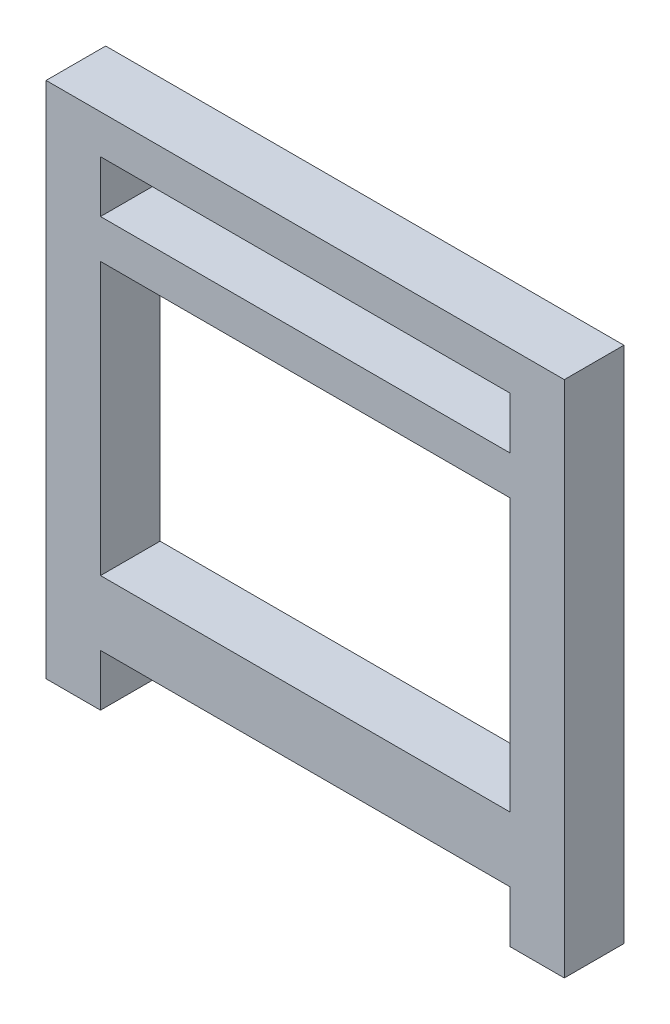
ISO-10303-21;
HEADER;
FILE_DESCRIPTION(('STEP AP214'),'2;1');
FILE_NAME('part.step','',(''),(''),'','','');
FILE_SCHEMA(('AUTOMOTIVE_DESIGN { 1 0 10303 214 1 1 1 1 }'));
ENDSEC;
DATA;
#1=APPLICATION_CONTEXT('core data for automotive mechanical design processes');
#2=APPLICATION_PROTOCOL_DEFINITION('international standard','automotive_design',2000,#1);
#3=PRODUCT_CONTEXT('',#1,'mechanical');
#4=PRODUCT('Part','Part','',(#3));
#5=PRODUCT_RELATED_PRODUCT_CATEGORY('part','',(#4));
#6=PRODUCT_DEFINITION_FORMATION('','',#4);
#7=PRODUCT_DEFINITION_CONTEXT('part definition',#1,'design');
#8=PRODUCT_DEFINITION('design','',#6,#7);
#9=PRODUCT_DEFINITION_SHAPE('','',#8);
#10=(LENGTH_UNIT() NAMED_UNIT(*) SI_UNIT(.MILLI.,.METRE.));
#11=(NAMED_UNIT(*) PLANE_ANGLE_UNIT() SI_UNIT($,.RADIAN.));
#12=(NAMED_UNIT(*) SI_UNIT($,.STERADIAN.) SOLID_ANGLE_UNIT());
#13=UNCERTAINTY_MEASURE_WITH_UNIT(LENGTH_MEASURE(1.E-05),#10,'distance_accuracy_value','');
#14=(GEOMETRIC_REPRESENTATION_CONTEXT(3) GLOBAL_UNCERTAINTY_ASSIGNED_CONTEXT((#13)) GLOBAL_UNIT_ASSIGNED_CONTEXT((#10,
#11,#12)) REPRESENTATION_CONTEXT('',''));
#15=CARTESIAN_POINT('',(0.,0.,0.));
#16=DIRECTION('',(0.,0.,1.));
#17=DIRECTION('',(1.,0.,0.));
#18=AXIS2_PLACEMENT_3D('',#15,#16,#17);
#19=CARTESIAN_POINT('',(0.,0.,2.3));
#20=DIRECTION('',(0.,0.,-1.));
#21=DIRECTION('',(-1.,0.,0.));
#22=AXIS2_PLACEMENT_3D('',#19,#20,#21);
#23=PLANE('',#22);
#24=DIRECTION('',(0.,1.,0.));
#25=VECTOR('',#24,1.);
#26=CARTESIAN_POINT('',(17.9,2.5,2.3));
#27=LINE('',#26,#25);
#28=CARTESIAN_POINT('',(17.9,2.5,2.3));
#29=VERTEX_POINT('',#28);
#30=CARTESIAN_POINT('',(17.9,13.,2.3));
#31=VERTEX_POINT('',#30);
#32=EDGE_CURVE('E207',#29,#31,#27,.T.);
#33=ORIENTED_EDGE('',*,*,#32,.F.);
#34=DIRECTION('',(1.,0.,0.));
#35=VECTOR('',#34,1.);
#36=CARTESIAN_POINT('',(2.1,2.5,2.3));
#37=LINE('',#36,#35);
#38=CARTESIAN_POINT('',(2.1,2.5,2.3));
#39=VERTEX_POINT('',#38);
#40=EDGE_CURVE('E218',#39,#29,#37,.T.);
#41=ORIENTED_EDGE('',*,*,#40,.F.);
#42=DIRECTION('',(0.,-1.,0.));
#43=VECTOR('',#42,1.);
#44=CARTESIAN_POINT('',(2.1,2.5,2.3));
#45=LINE('',#44,#43);
#46=CARTESIAN_POINT('',(2.1,13.,2.3));
#47=VERTEX_POINT('',#46);
#48=EDGE_CURVE('E214',#47,#39,#45,.T.);
#49=ORIENTED_EDGE('',*,*,#48,.F.);
#50=DIRECTION('',(-1.,0.,0.));
#51=VECTOR('',#50,1.);
#52=CARTESIAN_POINT('',(2.1,13.,2.3));
#53=LINE('',#52,#51);
#54=EDGE_CURVE('E210',#31,#47,#53,.T.);
#55=ORIENTED_EDGE('',*,*,#54,.F.);
#56=EDGE_LOOP('',(#33,#41,#49,#55));
#57=FACE_BOUND('',#56,.T.);
#58=DIRECTION('',(0.,-1.,0.));
#59=VECTOR('',#58,1.);
#60=CARTESIAN_POINT('',(0.,0.,2.3));
#61=LINE('',#60,#59);
#62=CARTESIAN_POINT('',(0.,18.,2.3));
#63=VERTEX_POINT('',#62);
#64=CARTESIAN_POINT('',(0.,-2.,2.3));
#65=VERTEX_POINT('',#64);
#66=EDGE_CURVE('E250',#63,#65,#61,.T.);
#67=ORIENTED_EDGE('',*,*,#66,.T.);
#68=DIRECTION('',(1.,0.,0.));
#69=VECTOR('',#68,1.);
#70=CARTESIAN_POINT('',(0.,-2.,2.3));
#71=LINE('',#70,#69);
#72=CARTESIAN_POINT('',(2.1,-2.,2.3));
#73=VERTEX_POINT('',#72);
#74=EDGE_CURVE('E253',#65,#73,#71,.T.);
#75=ORIENTED_EDGE('',*,*,#74,.T.);
#76=DIRECTION('',(0.,1.,0.));
#77=VECTOR('',#76,1.);
#78=CARTESIAN_POINT('',(2.1,-2.,2.3));
#79=LINE('',#78,#77);
#80=CARTESIAN_POINT('',(2.1,0.,2.3));
#81=VERTEX_POINT('',#80);
#82=EDGE_CURVE('E257',#73,#81,#79,.T.);
#83=ORIENTED_EDGE('',*,*,#82,.T.);
#84=DIRECTION('',(1.,0.,0.));
#85=VECTOR('',#84,1.);
#86=CARTESIAN_POINT('',(2.1,0.,2.3));
#87=LINE('',#86,#85);
#88=CARTESIAN_POINT('',(17.9,0.,2.3));
#89=VERTEX_POINT('',#88);
#90=EDGE_CURVE('E260',#81,#89,#87,.T.);
#91=ORIENTED_EDGE('',*,*,#90,.T.);
#92=DIRECTION('',(0.,-1.,0.));
#93=VECTOR('',#92,1.);
#94=CARTESIAN_POINT('',(17.9,-2.,2.3));
#95=LINE('',#94,#93);
#96=CARTESIAN_POINT('',(17.9,-2.,2.3));
#97=VERTEX_POINT('',#96);
#98=EDGE_CURVE('E263',#89,#97,#95,.T.);
#99=ORIENTED_EDGE('',*,*,#98,.T.);
#100=DIRECTION('',(1.,0.,0.));
#101=VECTOR('',#100,1.);
#102=CARTESIAN_POINT('',(20.,-2.,2.3));
#103=LINE('',#102,#101);
#104=CARTESIAN_POINT('',(20.,-2.,2.3));
#105=VERTEX_POINT('',#104);
#106=EDGE_CURVE('E266',#97,#105,#103,.T.);
#107=ORIENTED_EDGE('',*,*,#106,.T.);
#108=DIRECTION('',(0.,1.,0.));
#109=VECTOR('',#108,1.);
#110=CARTESIAN_POINT('',(20.,0.,2.3));
#111=LINE('',#110,#109);
#112=CARTESIAN_POINT('',(20.,18.,2.3));
#113=VERTEX_POINT('',#112);
#114=EDGE_CURVE('E269',#105,#113,#111,.T.);
#115=ORIENTED_EDGE('',*,*,#114,.T.);
#116=DIRECTION('',(-1.,0.,0.));
#117=VECTOR('',#116,1.);
#118=CARTESIAN_POINT('',(0.,18.,2.3));
#119=LINE('',#118,#117);
#120=EDGE_CURVE('E272',#113,#63,#119,.T.);
#121=ORIENTED_EDGE('',*,*,#120,.T.);
#122=EDGE_LOOP('',(#67,#75,#83,#91,#99,#107,#115,#121));
#123=FACE_BOUND('',#122,.T.);
#124=DIRECTION('',(0.,-1.,0.));
#125=VECTOR('',#124,1.);
#126=CARTESIAN_POINT('',(2.1,14.5,2.3));
#127=LINE('',#126,#125);
#128=CARTESIAN_POINT('',(2.1,16.5,2.3));
#129=VERTEX_POINT('',#128);
#130=CARTESIAN_POINT('',(2.1,14.5,2.3));
#131=VERTEX_POINT('',#130);
#132=EDGE_CURVE('E159',#129,#131,#127,.T.);
#133=ORIENTED_EDGE('',*,*,#132,.F.);
#134=DIRECTION('',(-1.,0.,0.));
#135=VECTOR('',#134,1.);
#136=CARTESIAN_POINT('',(2.1,16.5,2.3));
#137=LINE('',#136,#135);
#138=CARTESIAN_POINT('',(17.9,16.5,2.3));
#139=VERTEX_POINT('',#138);
#140=EDGE_CURVE('E185',#139,#129,#137,.T.);
#141=ORIENTED_EDGE('',*,*,#140,.F.);
#142=DIRECTION('',(0.,1.,0.));
#143=VECTOR('',#142,1.);
#144=CARTESIAN_POINT('',(17.9,14.5,2.3));
#145=LINE('',#144,#143);
#146=CARTESIAN_POINT('',(17.9,14.5,2.3));
#147=VERTEX_POINT('',#146);
#148=EDGE_CURVE('E181',#147,#139,#145,.T.);
#149=ORIENTED_EDGE('',*,*,#148,.F.);
#150=DIRECTION('',(1.,0.,0.));
#151=VECTOR('',#150,1.);
#152=CARTESIAN_POINT('',(2.1,14.5,2.3));
#153=LINE('',#152,#151);
#154=EDGE_CURVE('E168',#131,#147,#153,.T.);
#155=ORIENTED_EDGE('',*,*,#154,.F.);
#156=EDGE_LOOP('',(#133,#141,#149,#155));
#157=FACE_BOUND('',#156,.T.);
#158=ADVANCED_FACE('F45',(#57,#123,#157),#23,.F.);
#159=CARTESIAN_POINT('',(0.,0.,0.));
#160=DIRECTION('',(0.,0.,-1.));
#161=DIRECTION('',(-1.,0.,0.));
#162=AXIS2_PLACEMENT_3D('',#159,#160,#161);
#163=PLANE('',#162);
#164=DIRECTION('',(0.,-1.,0.));
#165=VECTOR('',#164,1.);
#166=CARTESIAN_POINT('',(0.,0.,0.));
#167=LINE('',#166,#165);
#168=CARTESIAN_POINT('',(0.,18.,0.));
#169=VERTEX_POINT('',#168);
#170=CARTESIAN_POINT('',(0.,-2.,0.));
#171=VERTEX_POINT('',#170);
#172=EDGE_CURVE('E249',#169,#171,#167,.T.);
#173=ORIENTED_EDGE('',*,*,#172,.F.);
#174=DIRECTION('',(-1.,0.,0.));
#175=VECTOR('',#174,1.);
#176=CARTESIAN_POINT('',(0.,18.,0.));
#177=LINE('',#176,#175);
#178=CARTESIAN_POINT('',(20.,18.,0.));
#179=VERTEX_POINT('',#178);
#180=EDGE_CURVE('E254',#179,#169,#177,.T.);
#181=ORIENTED_EDGE('',*,*,#180,.F.);
#182=DIRECTION('',(0.,1.,0.));
#183=VECTOR('',#182,1.);
#184=CARTESIAN_POINT('',(20.,0.,0.));
#185=LINE('',#184,#183);
#186=CARTESIAN_POINT('',(20.,-2.,0.));
#187=VERTEX_POINT('',#186);
#188=EDGE_CURVE('E294',#187,#179,#185,.T.);
#189=ORIENTED_EDGE('',*,*,#188,.F.);
#190=DIRECTION('',(1.,0.,0.));
#191=VECTOR('',#190,1.);
#192=CARTESIAN_POINT('',(20.,-2.,0.));
#193=LINE('',#192,#191);
#194=CARTESIAN_POINT('',(17.9,-2.,0.));
#195=VERTEX_POINT('',#194);
#196=EDGE_CURVE('E290',#195,#187,#193,.T.);
#197=ORIENTED_EDGE('',*,*,#196,.F.);
#198=DIRECTION('',(0.,-1.,0.));
#199=VECTOR('',#198,1.);
#200=CARTESIAN_POINT('',(17.9,-2.,0.));
#201=LINE('',#200,#199);
#202=CARTESIAN_POINT('',(17.9,0.,0.));
#203=VERTEX_POINT('',#202);
#204=EDGE_CURVE('E287',#203,#195,#201,.T.);
#205=ORIENTED_EDGE('',*,*,#204,.F.);
#206=DIRECTION('',(1.,0.,0.));
#207=VECTOR('',#206,1.);
#208=CARTESIAN_POINT('',(2.1,0.,0.));
#209=LINE('',#208,#207);
#210=CARTESIAN_POINT('',(2.1,0.,0.));
#211=VERTEX_POINT('',#210);
#212=EDGE_CURVE('E284',#211,#203,#209,.T.);
#213=ORIENTED_EDGE('',*,*,#212,.F.);
#214=DIRECTION('',(0.,1.,0.));
#215=VECTOR('',#214,1.);
#216=CARTESIAN_POINT('',(2.1,-2.,0.));
#217=LINE('',#216,#215);
#218=CARTESIAN_POINT('',(2.1,-2.,0.));
#219=VERTEX_POINT('',#218);
#220=EDGE_CURVE('E281',#219,#211,#217,.T.);
#221=ORIENTED_EDGE('',*,*,#220,.F.);
#222=DIRECTION('',(1.,0.,0.));
#223=VECTOR('',#222,1.);
#224=CARTESIAN_POINT('',(0.,-2.,0.));
#225=LINE('',#224,#223);
#226=EDGE_CURVE('E278',#171,#219,#225,.T.);
#227=ORIENTED_EDGE('',*,*,#226,.F.);
#228=EDGE_LOOP('',(#173,#181,#189,#197,#205,#213,#221,#227));
#229=FACE_BOUND('',#228,.T.);
#230=DIRECTION('',(1.,0.,0.));
#231=VECTOR('',#230,1.);
#232=CARTESIAN_POINT('',(2.1,2.5,0.));
#233=LINE('',#232,#231);
#234=CARTESIAN_POINT('',(2.1,2.5,0.));
#235=VERTEX_POINT('',#234);
#236=CARTESIAN_POINT('',(17.9,2.5,0.));
#237=VERTEX_POINT('',#236);
#238=EDGE_CURVE('E211',#235,#237,#233,.T.);
#239=ORIENTED_EDGE('',*,*,#238,.T.);
#240=DIRECTION('',(0.,1.,0.));
#241=VECTOR('',#240,1.);
#242=CARTESIAN_POINT('',(17.9,2.5,0.));
#243=LINE('',#242,#241);
#244=CARTESIAN_POINT('',(17.9,13.,0.));
#245=VERTEX_POINT('',#244);
#246=EDGE_CURVE('E177',#237,#245,#243,.T.);
#247=ORIENTED_EDGE('',*,*,#246,.T.);
#248=DIRECTION('',(-1.,0.,0.));
#249=VECTOR('',#248,1.);
#250=CARTESIAN_POINT('',(2.1,13.,0.));
#251=LINE('',#250,#249);
#252=CARTESIAN_POINT('',(2.1,13.,0.));
#253=VERTEX_POINT('',#252);
#254=EDGE_CURVE('E225',#245,#253,#251,.T.);
#255=ORIENTED_EDGE('',*,*,#254,.T.);
#256=DIRECTION('',(0.,-1.,0.));
#257=VECTOR('',#256,1.);
#258=CARTESIAN_POINT('',(2.1,2.5,0.));
#259=LINE('',#258,#257);
#260=EDGE_CURVE('E229',#253,#235,#259,.T.);
#261=ORIENTED_EDGE('',*,*,#260,.T.);
#262=EDGE_LOOP('',(#239,#247,#255,#261));
#263=FACE_BOUND('',#262,.T.);
#264=DIRECTION('',(-1.,0.,0.));
#265=VECTOR('',#264,1.);
#266=CARTESIAN_POINT('',(2.1,16.5,0.));
#267=LINE('',#266,#265);
#268=CARTESIAN_POINT('',(17.9,16.5,0.));
#269=VERTEX_POINT('',#268);
#270=CARTESIAN_POINT('',(2.1,16.5,0.));
#271=VERTEX_POINT('',#270);
#272=EDGE_CURVE('E169',#269,#271,#267,.T.);
#273=ORIENTED_EDGE('',*,*,#272,.T.);
#274=DIRECTION('',(0.,-1.,0.));
#275=VECTOR('',#274,1.);
#276=CARTESIAN_POINT('',(2.1,14.5,0.));
#277=LINE('',#276,#275);
#278=CARTESIAN_POINT('',(2.1,14.5,0.));
#279=VERTEX_POINT('',#278);
#280=EDGE_CURVE('E69',#271,#279,#277,.T.);
#281=ORIENTED_EDGE('',*,*,#280,.T.);
#282=DIRECTION('',(1.,0.,0.));
#283=VECTOR('',#282,1.);
#284=CARTESIAN_POINT('',(2.1,14.5,0.));
#285=LINE('',#284,#283);
#286=CARTESIAN_POINT('',(17.9,14.5,0.));
#287=VERTEX_POINT('',#286);
#288=EDGE_CURVE('E175',#279,#287,#285,.T.);
#289=ORIENTED_EDGE('',*,*,#288,.T.);
#290=DIRECTION('',(0.,1.,0.));
#291=VECTOR('',#290,1.);
#292=CARTESIAN_POINT('',(17.9,14.5,0.));
#293=LINE('',#292,#291);
#294=EDGE_CURVE('E194',#287,#269,#293,.T.);
#295=ORIENTED_EDGE('',*,*,#294,.T.);
#296=EDGE_LOOP('',(#273,#281,#289,#295));
#297=FACE_BOUND('',#296,.T.);
#298=ADVANCED_FACE('F335',(#229,#263,#297),#163,.T.);
#299=CARTESIAN_POINT('',(0.,0.,2.3));
#300=DIRECTION('',(1.,0.,0.));
#301=DIRECTION('',(0.,1.,0.));
#302=AXIS2_PLACEMENT_3D('',#299,#300,#301);
#303=PLANE('',#302);
#304=ORIENTED_EDGE('',*,*,#172,.T.);
#305=DIRECTION('',(0.,0.,-1.));
#306=VECTOR('',#305,1.);
#307=CARTESIAN_POINT('',(0.,-2.,2.3));
#308=LINE('',#307,#306);
#309=EDGE_CURVE('E11',#65,#171,#308,.T.);
#310=ORIENTED_EDGE('',*,*,#309,.F.);
#311=ORIENTED_EDGE('',*,*,#66,.F.);
#312=DIRECTION('',(0.,0.,-1.));
#313=VECTOR('',#312,1.);
#314=CARTESIAN_POINT('',(0.,18.,2.3));
#315=LINE('',#314,#313);
#316=EDGE_CURVE('E275',#63,#169,#315,.T.);
#317=ORIENTED_EDGE('',*,*,#316,.T.);
#318=EDGE_LOOP('',(#304,#310,#311,#317));
#319=FACE_BOUND('',#318,.T.);
#320=ADVANCED_FACE('F47',(#319),#303,.F.);
#321=CARTESIAN_POINT('',(0.,-2.,2.3));
#322=DIRECTION('',(0.,1.,0.));
#323=DIRECTION('',(0.,0.,1.));
#324=AXIS2_PLACEMENT_3D('',#321,#322,#323);
#325=PLANE('',#324);
#326=ORIENTED_EDGE('',*,*,#226,.T.);
#327=DIRECTION('',(0.,0.,-1.));
#328=VECTOR('',#327,1.);
#329=CARTESIAN_POINT('',(2.1,-2.,2.3));
#330=LINE('',#329,#328);
#331=EDGE_CURVE('E54',#73,#219,#330,.T.);
#332=ORIENTED_EDGE('',*,*,#331,.F.);
#333=ORIENTED_EDGE('',*,*,#74,.F.);
#334=ORIENTED_EDGE('',*,*,#309,.T.);
#335=EDGE_LOOP('',(#326,#332,#333,#334));
#336=FACE_BOUND('',#335,.T.);
#337=ADVANCED_FACE('F352',(#336),#325,.F.);
#338=CARTESIAN_POINT('',(2.1,-2.,2.3));
#339=DIRECTION('',(-1.,0.,0.));
#340=DIRECTION('',(0.,0.,1.));
#341=AXIS2_PLACEMENT_3D('',#338,#339,#340);
#342=PLANE('',#341);
#343=ORIENTED_EDGE('',*,*,#220,.T.);
#344=DIRECTION('',(0.,0.,-1.));
#345=VECTOR('',#344,1.);
#346=CARTESIAN_POINT('',(2.1,0.,2.3));
#347=LINE('',#346,#345);
#348=EDGE_CURVE('E319',#81,#211,#347,.T.);
#349=ORIENTED_EDGE('',*,*,#348,.F.);
#350=ORIENTED_EDGE('',*,*,#82,.F.);
#351=ORIENTED_EDGE('',*,*,#331,.T.);
#352=EDGE_LOOP('',(#343,#349,#350,#351));
#353=FACE_BOUND('',#352,.T.);
#354=ADVANCED_FACE('F328',(#353),#342,.F.);
#355=CARTESIAN_POINT('',(2.1,0.,2.3));
#356=DIRECTION('',(0.,1.,0.));
#357=DIRECTION('',(0.,0.,1.));
#358=AXIS2_PLACEMENT_3D('',#355,#356,#357);
#359=PLANE('',#358);
#360=ORIENTED_EDGE('',*,*,#212,.T.);
#361=DIRECTION('',(0.,0.,-1.));
#362=VECTOR('',#361,1.);
#363=CARTESIAN_POINT('',(17.9,0.,2.3));
#364=LINE('',#363,#362);
#365=EDGE_CURVE('E315',#89,#203,#364,.T.);
#366=ORIENTED_EDGE('',*,*,#365,.F.);
#367=ORIENTED_EDGE('',*,*,#90,.F.);
#368=ORIENTED_EDGE('',*,*,#348,.T.);
#369=EDGE_LOOP('',(#360,#366,#367,#368));
#370=FACE_BOUND('',#369,.T.);
#371=ADVANCED_FACE('F341',(#370),#359,.F.);
#372=CARTESIAN_POINT('',(17.9,-2.,2.3));
#373=DIRECTION('',(1.,0.,0.));
#374=DIRECTION('',(0.,0.,-1.));
#375=AXIS2_PLACEMENT_3D('',#372,#373,#374);
#376=PLANE('',#375);
#377=ORIENTED_EDGE('',*,*,#204,.T.);
#378=DIRECTION('',(0.,0.,-1.));
#379=VECTOR('',#378,1.);
#380=CARTESIAN_POINT('',(17.9,-2.,2.3));
#381=LINE('',#380,#379);
#382=EDGE_CURVE('E311',#97,#195,#381,.T.);
#383=ORIENTED_EDGE('',*,*,#382,.F.);
#384=ORIENTED_EDGE('',*,*,#98,.F.);
#385=ORIENTED_EDGE('',*,*,#365,.T.);
#386=EDGE_LOOP('',(#377,#383,#384,#385));
#387=FACE_BOUND('',#386,.T.);
#388=ADVANCED_FACE('F345',(#387),#376,.F.);
#389=CARTESIAN_POINT('',(20.,-2.,2.3));
#390=DIRECTION('',(0.,1.,0.));
#391=DIRECTION('',(-1.,0.,0.));
#392=AXIS2_PLACEMENT_3D('',#389,#390,#391);
#393=PLANE('',#392);
#394=ORIENTED_EDGE('',*,*,#196,.T.);
#395=DIRECTION('',(0.,0.,-1.));
#396=VECTOR('',#395,1.);
#397=CARTESIAN_POINT('',(20.,-2.,2.3));
#398=LINE('',#397,#396);
#399=EDGE_CURVE('E307',#105,#187,#398,.T.);
#400=ORIENTED_EDGE('',*,*,#399,.F.);
#401=ORIENTED_EDGE('',*,*,#106,.F.);
#402=ORIENTED_EDGE('',*,*,#382,.T.);
#403=EDGE_LOOP('',(#394,#400,#401,#402));
#404=FACE_BOUND('',#403,.T.);
#405=ADVANCED_FACE('F364',(#404),#393,.F.);
#406=CARTESIAN_POINT('',(20.,0.,2.3));
#407=DIRECTION('',(-1.,0.,0.));
#408=DIRECTION('',(0.,0.,1.));
#409=AXIS2_PLACEMENT_3D('',#406,#407,#408);
#410=PLANE('',#409);
#411=ORIENTED_EDGE('',*,*,#188,.T.);
#412=DIRECTION('',(0.,0.,-1.));
#413=VECTOR('',#412,1.);
#414=CARTESIAN_POINT('',(20.,18.,2.3));
#415=LINE('',#414,#413);
#416=EDGE_CURVE('E303',#113,#179,#415,.T.);
#417=ORIENTED_EDGE('',*,*,#416,.F.);
#418=ORIENTED_EDGE('',*,*,#114,.F.);
#419=ORIENTED_EDGE('',*,*,#399,.T.);
#420=EDGE_LOOP('',(#411,#417,#418,#419));
#421=FACE_BOUND('',#420,.T.);
#422=ADVANCED_FACE('F362',(#421),#410,.F.);
#423=CARTESIAN_POINT('',(0.,18.,2.3));
#424=DIRECTION('',(0.,-1.,0.));
#425=DIRECTION('',(0.,0.,-1.));
#426=AXIS2_PLACEMENT_3D('',#423,#424,#425);
#427=PLANE('',#426);
#428=ORIENTED_EDGE('',*,*,#180,.T.);
#429=ORIENTED_EDGE('',*,*,#316,.F.);
#430=ORIENTED_EDGE('',*,*,#120,.F.);
#431=ORIENTED_EDGE('',*,*,#416,.T.);
#432=EDGE_LOOP('',(#428,#429,#430,#431));
#433=FACE_BOUND('',#432,.T.);
#434=ADVANCED_FACE('F357',(#433),#427,.F.);
#435=CARTESIAN_POINT('',(17.9,2.5,2.3));
#436=DIRECTION('',(-1.,0.,0.));
#437=DIRECTION('',(0.,0.,1.));
#438=AXIS2_PLACEMENT_3D('',#435,#436,#437);
#439=PLANE('',#438);
#440=ORIENTED_EDGE('',*,*,#246,.F.);
#441=DIRECTION('',(0.,0.,-1.));
#442=VECTOR('',#441,1.);
#443=CARTESIAN_POINT('',(17.9,2.5,2.3));
#444=LINE('',#443,#442);
#445=EDGE_CURVE('E221',#29,#237,#444,.T.);
#446=ORIENTED_EDGE('',*,*,#445,.F.);
#447=ORIENTED_EDGE('',*,*,#32,.T.);
#448=DIRECTION('',(0.,0.,-1.));
#449=VECTOR('',#448,1.);
#450=CARTESIAN_POINT('',(17.9,13.,2.3));
#451=LINE('',#450,#449);
#452=EDGE_CURVE('E245',#31,#245,#451,.T.);
#453=ORIENTED_EDGE('',*,*,#452,.T.);
#454=EDGE_LOOP('',(#440,#446,#447,#453));
#455=FACE_BOUND('',#454,.T.);
#456=ADVANCED_FACE('F382',(#455),#439,.T.);
#457=CARTESIAN_POINT('',(2.1,13.,2.3));
#458=DIRECTION('',(0.,-1.,0.));
#459=DIRECTION('',(0.,0.,-1.));
#460=AXIS2_PLACEMENT_3D('',#457,#458,#459);
#461=PLANE('',#460);
#462=ORIENTED_EDGE('',*,*,#254,.F.);
#463=ORIENTED_EDGE('',*,*,#452,.F.);
#464=ORIENTED_EDGE('',*,*,#54,.T.);
#465=DIRECTION('',(0.,0.,-1.));
#466=VECTOR('',#465,1.);
#467=CARTESIAN_POINT('',(2.1,13.,2.3));
#468=LINE('',#467,#466);
#469=EDGE_CURVE('E242',#47,#253,#468,.T.);
#470=ORIENTED_EDGE('',*,*,#469,.T.);
#471=EDGE_LOOP('',(#462,#463,#464,#470));
#472=FACE_BOUND('',#471,.T.);
#473=ADVANCED_FACE('F389',(#472),#461,.T.);
#474=CARTESIAN_POINT('',(2.1,2.5,2.3));
#475=DIRECTION('',(1.,0.,0.));
#476=DIRECTION('',(0.,0.,-1.));
#477=AXIS2_PLACEMENT_3D('',#474,#475,#476);
#478=PLANE('',#477);
#479=ORIENTED_EDGE('',*,*,#260,.F.);
#480=ORIENTED_EDGE('',*,*,#469,.F.);
#481=ORIENTED_EDGE('',*,*,#48,.T.);
#482=DIRECTION('',(0.,0.,-1.));
#483=VECTOR('',#482,1.);
#484=CARTESIAN_POINT('',(2.1,2.5,2.3));
#485=LINE('',#484,#483);
#486=EDGE_CURVE('E239',#39,#235,#485,.T.);
#487=ORIENTED_EDGE('',*,*,#486,.T.);
#488=EDGE_LOOP('',(#479,#480,#481,#487));
#489=FACE_BOUND('',#488,.T.);
#490=ADVANCED_FACE('F394',(#489),#478,.T.);
#491=CARTESIAN_POINT('',(2.1,2.5,2.3));
#492=DIRECTION('',(0.,1.,0.));
#493=DIRECTION('',(0.,0.,1.));
#494=AXIS2_PLACEMENT_3D('',#491,#492,#493);
#495=PLANE('',#494);
#496=ORIENTED_EDGE('',*,*,#238,.F.);
#497=ORIENTED_EDGE('',*,*,#486,.F.);
#498=ORIENTED_EDGE('',*,*,#40,.T.);
#499=ORIENTED_EDGE('',*,*,#445,.T.);
#500=EDGE_LOOP('',(#496,#497,#498,#499));
#501=FACE_BOUND('',#500,.T.);
#502=ADVANCED_FACE('F400',(#501),#495,.T.);
#503=CARTESIAN_POINT('',(2.1,14.5,2.3));
#504=DIRECTION('',(1.,0.,0.));
#505=DIRECTION('',(0.,0.,-1.));
#506=AXIS2_PLACEMENT_3D('',#503,#504,#505);
#507=PLANE('',#506);
#508=ORIENTED_EDGE('',*,*,#280,.F.);
#509=DIRECTION('',(0.,0.,-1.));
#510=VECTOR('',#509,1.);
#511=CARTESIAN_POINT('',(2.1,16.5,2.3));
#512=LINE('',#511,#510);
#513=EDGE_CURVE('E163',#129,#271,#512,.T.);
#514=ORIENTED_EDGE('',*,*,#513,.F.);
#515=ORIENTED_EDGE('',*,*,#132,.T.);
#516=DIRECTION('',(0.,0.,-1.));
#517=VECTOR('',#516,1.);
#518=CARTESIAN_POINT('',(2.1,14.5,2.3));
#519=LINE('',#518,#517);
#520=EDGE_CURVE('E162',#131,#279,#519,.T.);
#521=ORIENTED_EDGE('',*,*,#520,.T.);
#522=EDGE_LOOP('',(#508,#514,#515,#521));
#523=FACE_BOUND('',#522,.T.);
#524=ADVANCED_FACE('F161',(#523),#507,.T.);
#525=CARTESIAN_POINT('',(2.1,14.5,2.3));
#526=DIRECTION('',(0.,1.,0.));
#527=DIRECTION('',(0.,0.,1.));
#528=AXIS2_PLACEMENT_3D('',#525,#526,#527);
#529=PLANE('',#528);
#530=ORIENTED_EDGE('',*,*,#288,.F.);
#531=ORIENTED_EDGE('',*,*,#520,.F.);
#532=ORIENTED_EDGE('',*,*,#154,.T.);
#533=DIRECTION('',(0.,0.,-1.));
#534=VECTOR('',#533,1.);
#535=CARTESIAN_POINT('',(17.9,14.5,2.3));
#536=LINE('',#535,#534);
#537=EDGE_CURVE('E178',#147,#287,#536,.T.);
#538=ORIENTED_EDGE('',*,*,#537,.T.);
#539=EDGE_LOOP('',(#530,#531,#532,#538));
#540=FACE_BOUND('',#539,.T.);
#541=ADVANCED_FACE('F172',(#540),#529,.T.);
#542=CARTESIAN_POINT('',(17.9,14.5,2.3));
#543=DIRECTION('',(-1.,0.,0.));
#544=DIRECTION('',(0.,0.,1.));
#545=AXIS2_PLACEMENT_3D('',#542,#543,#544);
#546=PLANE('',#545);
#547=ORIENTED_EDGE('',*,*,#294,.F.);
#548=ORIENTED_EDGE('',*,*,#537,.F.);
#549=ORIENTED_EDGE('',*,*,#148,.T.);
#550=DIRECTION('',(0.,0.,-1.));
#551=VECTOR('',#550,1.);
#552=CARTESIAN_POINT('',(17.9,16.5,2.3));
#553=LINE('',#552,#551);
#554=EDGE_CURVE('E61',#139,#269,#553,.T.);
#555=ORIENTED_EDGE('',*,*,#554,.T.);
#556=EDGE_LOOP('',(#547,#548,#549,#555));
#557=FACE_BOUND('',#556,.T.);
#558=ADVANCED_FACE('F419',(#557),#546,.T.);
#559=CARTESIAN_POINT('',(2.1,16.5,2.3));
#560=DIRECTION('',(0.,-1.,0.));
#561=DIRECTION('',(0.,0.,-1.));
#562=AXIS2_PLACEMENT_3D('',#559,#560,#561);
#563=PLANE('',#562);
#564=ORIENTED_EDGE('',*,*,#272,.F.);
#565=ORIENTED_EDGE('',*,*,#554,.F.);
#566=ORIENTED_EDGE('',*,*,#140,.T.);
#567=ORIENTED_EDGE('',*,*,#513,.T.);
#568=EDGE_LOOP('',(#564,#565,#566,#567));
#569=FACE_BOUND('',#568,.T.);
#570=ADVANCED_FACE('F422',(#569),#563,.T.);
#571=CLOSED_SHELL('',(#158,#298,#320,#337,#354,#371,#388,#405,#422,#434,#456,#473,#490,#502,
#524,#541,#558,#570));
#572=MANIFOLD_SOLID_BREP('B2',#571);
#573=ADVANCED_BREP_SHAPE_REPRESENTATION('',(#18,#572),#14);
#574=SHAPE_DEFINITION_REPRESENTATION(#9,#573);
ENDSEC;
END-ISO-10303-21;
